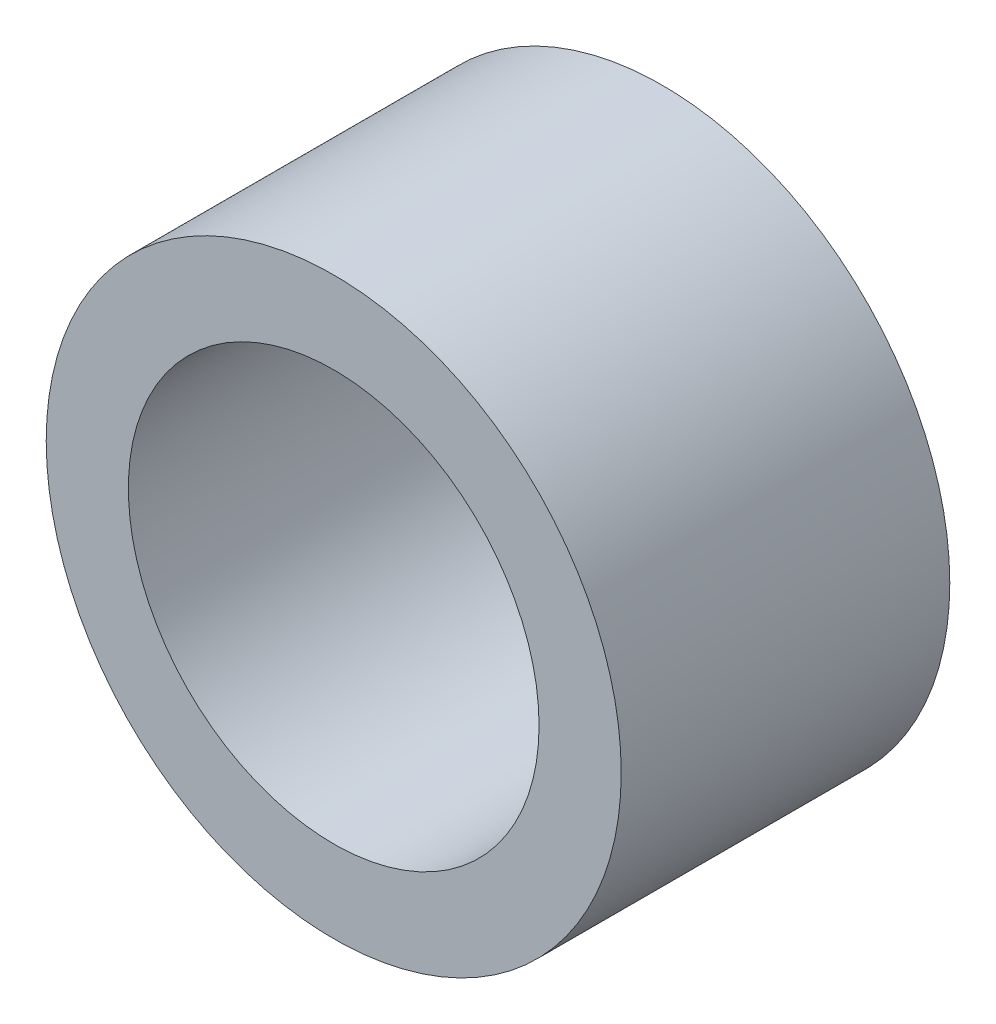
ISO-10303-21;
HEADER;
FILE_DESCRIPTION(('STEP AP214'),'2;1');
FILE_NAME('part.step','',(''),(''),'','','');
FILE_SCHEMA(('AUTOMOTIVE_DESIGN { 1 0 10303 214 1 1 1 1 }'));
ENDSEC;
DATA;
#1=APPLICATION_CONTEXT('core data for automotive mechanical design processes');
#2=APPLICATION_PROTOCOL_DEFINITION('international standard','automotive_design',2000,#1);
#3=PRODUCT_CONTEXT('',#1,'mechanical');
#4=PRODUCT('Part','Part','',(#3));
#5=PRODUCT_RELATED_PRODUCT_CATEGORY('part','',(#4));
#6=PRODUCT_DEFINITION_FORMATION('','',#4);
#7=PRODUCT_DEFINITION_CONTEXT('part definition',#1,'design');
#8=PRODUCT_DEFINITION('design','',#6,#7);
#9=PRODUCT_DEFINITION_SHAPE('','',#8);
#10=(LENGTH_UNIT() NAMED_UNIT(*) SI_UNIT(.MILLI.,.METRE.));
#11=(NAMED_UNIT(*) PLANE_ANGLE_UNIT() SI_UNIT($,.RADIAN.));
#12=(NAMED_UNIT(*) SI_UNIT($,.STERADIAN.) SOLID_ANGLE_UNIT());
#13=UNCERTAINTY_MEASURE_WITH_UNIT(LENGTH_MEASURE(1.E-05),#10,'distance_accuracy_value','');
#14=(GEOMETRIC_REPRESENTATION_CONTEXT(3) GLOBAL_UNCERTAINTY_ASSIGNED_CONTEXT((#13)) GLOBAL_UNIT_ASSIGNED_CONTEXT((#10,
#11,#12)) REPRESENTATION_CONTEXT('',''));
#15=CARTESIAN_POINT('',(0.,0.,0.));
#16=DIRECTION('',(0.,0.,1.));
#17=DIRECTION('',(1.,0.,0.));
#18=AXIS2_PLACEMENT_3D('',#15,#16,#17);
#19=CARTESIAN_POINT('',(0.,0.,-25.4));
#20=DIRECTION('',(0.,0.,1.));
#21=DIRECTION('',(1.,0.,0.));
#22=AXIS2_PLACEMENT_3D('',#19,#20,#21);
#23=CYLINDRICAL_SURFACE('',#22,44.45);
#24=CARTESIAN_POINT('',(0.,0.,-25.4));
#25=DIRECTION('',(0.,0.,1.));
#26=DIRECTION('',(1.,0.,0.));
#27=AXIS2_PLACEMENT_3D('',#24,#25,#26);
#28=CIRCLE('',#27,44.45);
#29=CARTESIAN_POINT('',(44.45,0.,-25.4));
#30=VERTEX_POINT('',#29);
#31=EDGE_CURVE('E10',#30,#30,#28,.T.);
#32=ORIENTED_EDGE('',*,*,#31,.T.);
#33=EDGE_LOOP('',(#32));
#34=FACE_BOUND('',#33,.T.);
#35=CARTESIAN_POINT('',(0.,0.,25.4));
#36=DIRECTION('',(0.,0.,1.));
#37=DIRECTION('',(1.,0.,0.));
#38=AXIS2_PLACEMENT_3D('',#35,#36,#37);
#39=CIRCLE('',#38,44.45);
#40=CARTESIAN_POINT('',(44.45,0.,25.4));
#41=VERTEX_POINT('',#40);
#42=EDGE_CURVE('E40',#41,#41,#39,.T.);
#43=ORIENTED_EDGE('',*,*,#42,.F.);
#44=EDGE_LOOP('',(#43));
#45=FACE_BOUND('',#44,.T.);
#46=ADVANCED_FACE('F37',(#34,#45),#23,.T.);
#47=CARTESIAN_POINT('',(0.,0.,-25.4));
#48=DIRECTION('',(0.,0.,1.));
#49=DIRECTION('',(1.,0.,0.));
#50=AXIS2_PLACEMENT_3D('',#47,#48,#49);
#51=PLANE('',#50);
#52=CARTESIAN_POINT('',(0.,0.,-25.4));
#53=DIRECTION('',(0.,0.,1.));
#54=DIRECTION('',(1.,0.,0.));
#55=AXIS2_PLACEMENT_3D('',#52,#53,#54);
#56=CIRCLE('',#55,31.75);
#57=CARTESIAN_POINT('',(31.75,0.,-25.4));
#58=VERTEX_POINT('',#57);
#59=EDGE_CURVE('E49',#58,#58,#56,.T.);
#60=ORIENTED_EDGE('',*,*,#59,.T.);
#61=EDGE_LOOP('',(#60));
#62=FACE_BOUND('',#61,.T.);
#63=ORIENTED_EDGE('',*,*,#31,.F.);
#64=EDGE_LOOP('',(#63));
#65=FACE_BOUND('',#64,.T.);
#66=ADVANCED_FACE('F59',(#62,#65),#51,.F.);
#67=CARTESIAN_POINT('',(0.,0.,25.4));
#68=DIRECTION('',(0.,0.,1.));
#69=DIRECTION('',(1.,0.,0.));
#70=AXIS2_PLACEMENT_3D('',#67,#68,#69);
#71=PLANE('',#70);
#72=CARTESIAN_POINT('',(0.,0.,25.4));
#73=DIRECTION('',(0.,0.,1.));
#74=DIRECTION('',(1.,0.,0.));
#75=AXIS2_PLACEMENT_3D('',#72,#73,#74);
#76=CIRCLE('',#75,31.75);
#77=CARTESIAN_POINT('',(31.75,0.,25.4));
#78=VERTEX_POINT('',#77);
#79=EDGE_CURVE('E51',#78,#78,#76,.T.);
#80=ORIENTED_EDGE('',*,*,#79,.F.);
#81=EDGE_LOOP('',(#80));
#82=FACE_BOUND('',#81,.T.);
#83=ORIENTED_EDGE('',*,*,#42,.T.);
#84=EDGE_LOOP('',(#83));
#85=FACE_BOUND('',#84,.T.);
#86=ADVANCED_FACE('F65',(#82,#85),#71,.T.);
#87=CARTESIAN_POINT('',(0.,0.,-25.4));
#88=DIRECTION('',(0.,0.,1.));
#89=DIRECTION('',(1.,0.,0.));
#90=AXIS2_PLACEMENT_3D('',#87,#88,#89);
#91=CYLINDRICAL_SURFACE('',#90,31.75);
#92=ORIENTED_EDGE('',*,*,#59,.F.);
#93=EDGE_LOOP('',(#92));
#94=FACE_BOUND('',#93,.T.);
#95=ORIENTED_EDGE('',*,*,#79,.T.);
#96=EDGE_LOOP('',(#95));
#97=FACE_BOUND('',#96,.T.);
#98=ADVANCED_FACE('F62',(#94,#97),#91,.F.);
#99=CLOSED_SHELL('',(#46,#66,#86,#98));
#100=MANIFOLD_SOLID_BREP('B2',#99);
#101=ADVANCED_BREP_SHAPE_REPRESENTATION('',(#18,#100),#14);
#102=SHAPE_DEFINITION_REPRESENTATION(#9,#101);
ENDSEC;
END-ISO-10303-21;
